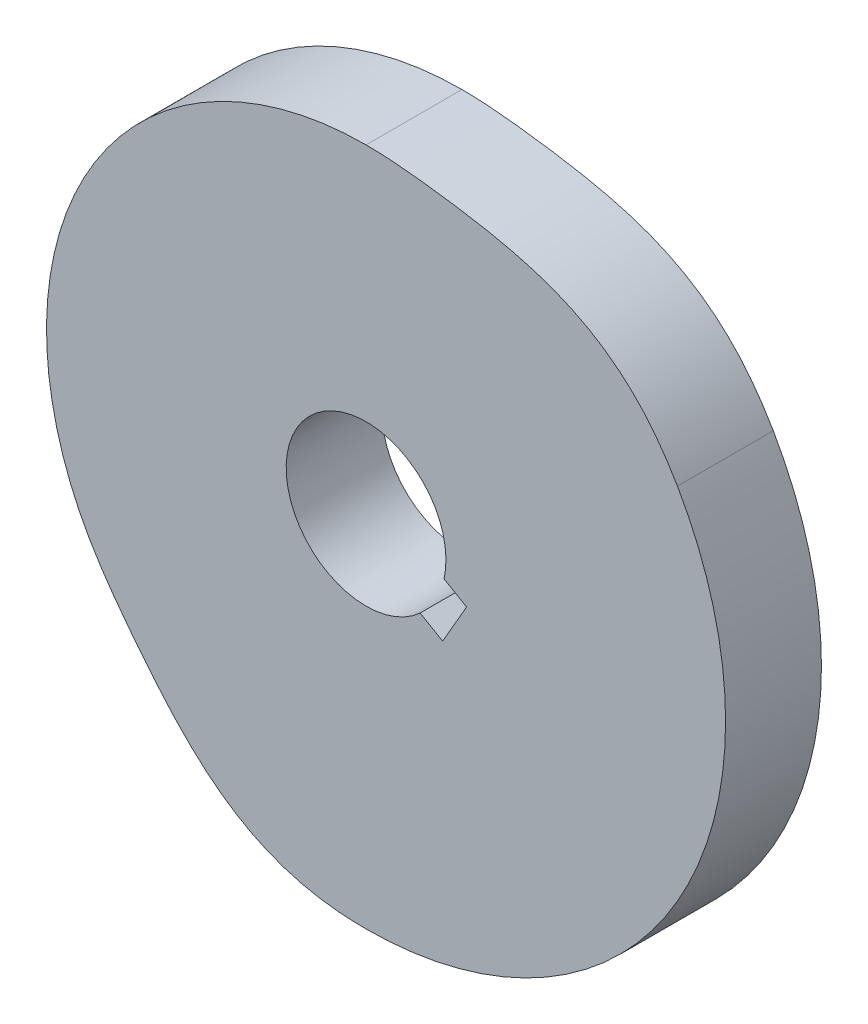
ISO-10303-21;
HEADER;
FILE_DESCRIPTION(('STEP AP214'),'2;1');
FILE_NAME('part.step','',(''),(''),'','','');
FILE_SCHEMA(('AUTOMOTIVE_DESIGN { 1 0 10303 214 1 1 1 1 }'));
ENDSEC;
DATA;
#1=APPLICATION_CONTEXT('core data for automotive mechanical design processes');
#2=APPLICATION_PROTOCOL_DEFINITION('international standard','automotive_design',2000,#1);
#3=PRODUCT_CONTEXT('',#1,'mechanical');
#4=PRODUCT('Part','Part','',(#3));
#5=PRODUCT_RELATED_PRODUCT_CATEGORY('part','',(#4));
#6=PRODUCT_DEFINITION_FORMATION('','',#4);
#7=PRODUCT_DEFINITION_CONTEXT('part definition',#1,'design');
#8=PRODUCT_DEFINITION('design','',#6,#7);
#9=PRODUCT_DEFINITION_SHAPE('','',#8);
#10=(LENGTH_UNIT() NAMED_UNIT(*) SI_UNIT(.MILLI.,.METRE.));
#11=(NAMED_UNIT(*) PLANE_ANGLE_UNIT() SI_UNIT($,.RADIAN.));
#12=(NAMED_UNIT(*) SI_UNIT($,.STERADIAN.) SOLID_ANGLE_UNIT());
#13=UNCERTAINTY_MEASURE_WITH_UNIT(LENGTH_MEASURE(1.E-05),#10,'distance_accuracy_value','');
#14=(GEOMETRIC_REPRESENTATION_CONTEXT(3) GLOBAL_UNCERTAINTY_ASSIGNED_CONTEXT((#13)) GLOBAL_UNIT_ASSIGNED_CONTEXT((#10,
#11,#12)) REPRESENTATION_CONTEXT('',''));
#15=CARTESIAN_POINT('',(0.,0.,0.));
#16=DIRECTION('',(0.,0.,1.));
#17=DIRECTION('',(1.,0.,0.));
#18=AXIS2_PLACEMENT_3D('',#15,#16,#17);
#19=CARTESIAN_POINT('',(22.119846890356,36.5237513878752,12.));
#20=DIRECTION('',(0.,0.,1.));
#21=DIRECTION('',(1.,0.,0.));
#22=AXIS2_PLACEMENT_3D('',#19,#20,#21);
#23=PLANE('',#22);
#24=CARTESIAN_POINT('',(38.9711431702997,22.5,12.));
#25=CARTESIAN_POINT('',(38.7093504689134,22.9534419073022,12.));
#26=CARTESIAN_POINT('',(38.3047692242053,23.6267678396488,12.));
#27=CARTESIAN_POINT('',(37.7390404591507,24.5080117448406,12.));
#28=CARTESIAN_POINT('',(37.3010685746849,25.1598808103304,12.));
#29=CARTESIAN_POINT('',(36.8489283465686,25.8018937636039,12.));
#30=CARTESIAN_POINT('',(36.382207824954,26.43322654574,12.));
#31=CARTESIAN_POINT('',(35.9005756392599,27.0530443597118,12.));
#32=CARTESIAN_POINT('',(35.4037872006203,27.6605116103725,12.));
#33=CARTESIAN_POINT('',(34.8916893229601,28.2548023938018,12.));
#34=CARTESIAN_POINT('',(34.3642236103499,28.8351110024589,12.));
#35=CARTESIAN_POINT('',(33.8214284616266,29.4006623875112,12.));
#36=CARTESIAN_POINT('',(33.2634397017839,29.9507223900795,12.));
#37=CARTESIAN_POINT('',(32.6904898334102,30.4846075886696,12.));
#38=CARTESIAN_POINT('',(32.1029059323825,31.0016946046913,12.));
#39=CARTESIAN_POINT('',(31.5011062301754,31.5014287169865,12.));
#40=CARTESIAN_POINT('',(30.8855954460521,31.9833316448601,12.));
#41=CARTESIAN_POINT('',(30.2569589513353,32.4470083710961,12.));
#42=CARTESIAN_POINT('',(29.6158558656481,32.8921528905651,12.));
#43=CARTESIAN_POINT('',(28.9630112007715,33.3185527862826,12.));
#44=CARTESIAN_POINT('',(28.2992071813623,33.7260925527251,12.));
#45=CARTESIAN_POINT('',(27.6252738829632,34.1147556054543,12.));
#46=CARTESIAN_POINT('',(26.9420793363941,34.484624936213,12.));
#47=CARTESIAN_POINT('',(26.2505192536856,34.8358823932325,12.));
#48=CARTESIAN_POINT('',(25.5515065342268,35.1688065871312,12.));
#49=CARTESIAN_POINT('',(24.8459607108292,35.4837694431672,12.));
#50=CARTESIAN_POINT('',(24.134797494056,35.7812314404241,12.));
#51=CARTESIAN_POINT('',(23.4189185695591,36.0617355975334,12.));
#52=CARTESIAN_POINT('',(22.6992017974223,36.3259002825346,12.));
#53=CARTESIAN_POINT('',(21.9764919547547,36.5744109412834,12.));
#54=CARTESIAN_POINT('',(21.2515921531299,36.808010854258,12.));
#55=CARTESIAN_POINT('',(20.5252560510446,37.0274910455338,12.));
#56=CARTESIAN_POINT('',(19.7981809685145,37.2336794799527,12.));
#57=CARTESIAN_POINT('',(19.0710019963762,37.4274296949713,12.));
#58=CARTESIAN_POINT('',(18.3442871770079,37.6096090222078,12.));
#59=CARTESIAN_POINT('',(17.6185338162174,37.7810865602196,12.));
#60=CARTESIAN_POINT('',(16.894165968219,37.9427210644523,12.));
#61=CARTESIAN_POINT('',(16.1715331172115,38.0953489225405,12.));
#62=CARTESIAN_POINT('',(15.4509100603719,38.2397723831727,12.));
#63=CARTESIAN_POINT('',(14.7324979784421,38.3767482045367,12.));
#64=CARTESIAN_POINT('',(14.0164266618361,38.5069768839167,12.));
#65=CARTESIAN_POINT('',(13.3027578426846,38.631092623328,12.));
#66=CARTESIAN_POINT('',(12.5914895667666,38.7496541771411,12.));
#67=CARTESIAN_POINT('',(11.8825615241336,38.8631367164892,12.));
#68=CARTESIAN_POINT('',(11.175861243619,38.9719248319138,12.));
#69=CARTESIAN_POINT('',(10.47123104448,39.0763067802686,12.));
#70=CARTESIAN_POINT('',(9.76847562821939,39.176470064522,12.));
#71=CARTESIAN_POINT('',(9.06737018518749,39.2724984160128,12.));
#72=CARTESIAN_POINT('',(8.36766888386886,39.364370228242,12.));
#73=CARTESIAN_POINT('',(7.66911360575998,39.4519584698388,12.));
#74=CARTESIAN_POINT('',(6.97144278555543,39.5350320823696,12.));
#75=CARTESIAN_POINT('',(6.27440021466674,39.6132588467296,12.));
#76=CARTESIAN_POINT('',(5.5777436673017,39.6862096801998,12.));
#77=CARTESIAN_POINT('',(4.88125320765911,39.7533643061656,12.));
#78=CARTESIAN_POINT('',(4.18473905253608,39.8141182171193,12.));
#79=CARTESIAN_POINT('',(3.48804882810067,39.8677908410397,12.));
#80=CARTESIAN_POINT('',(2.7910742253825,39.9136347775381,12.));
#81=CARTESIAN_POINT('',(2.09375648407673,39.9508460581246,12.));
#82=CARTESIAN_POINT('',(1.1635601760718,39.9878170709664,12.));
#83=CARTESIAN_POINT('',(0.465431100008381,39.9999991230516,12.));
#84=CARTESIAN_POINT('',(0.,40.,12.));
#85=B_SPLINE_CURVE_WITH_KNOTS('',3,(#24,#25,#26,#27,#28,#29,#30,#31,#32,#33,#34,#35,#36,#37,#38,
#39,#40,#41,#42,#43,#44,#45,#46,#47,#48,#49,#50,#51,#52,#53,#54,#55,#56,#57,#58,#59,#60,#61,#62,
#63,#64,#65,#66,#67,#68,#69,#70,#71,#72,#73,#74,#75,#76,#77,#78,#79,#80,#81,#82,#83,#84),
.UNSPECIFIED.,.F.,.F.,(4,1,1,1,1,1,1,1,1,1,1,1,1,1,1,1,1,1,1,1,1,1,1,1,1,1,1,1,1,1,1,1,1,1,1,1,
1,1,1,1,1,1,1,1,1,1,1,1,1,1,1,1,1,1,1,1,1,1,4),(0.,0.0349656903816201,0.0524477612049712,
0.0699285137320489,0.0874071515107975,0.104882797102223,0.122354543573216,0.139821493872081,
0.157282786439406,0.174737606137087,0.192185180345596,0.20962476085127,0.227055592887446,
0.244476873371175,0.261887700958334,0.279287020995444,0.296673568753541,0.314045814472995,
0.331401913722197,0.348739666380906,0.366056487213003,0.383349390513558,0.400614990727402,
0.417849520270271,0.43504886507025,0.452208617616787,0.469324146585199,0.486390681420865,
0.503403409640334,0.520357584053338,0.537248636644474,0.554072295487663,0.570824700810579,
0.587502516189498,0.604103030846312,0.620624249147377,0.637064963675924,0.653424808671017,
0.669704291197709,0.685904798129849,0.702028577875175,0.718078696727588,0.73405897075783,
0.749973875203704,0.765828434337396,0.781628095707418,0.797378593412965,0.813085805611701,
0.828755611743744,0.844393754948468,0.860005714852658,0.875596595336954,0.89117103108201,
0.906733115712345,0.92228635326037,0.937833633534871,0.953377230863467,0.968918824644994,1.),.UNSPECIFIED.);
#86=CARTESIAN_POINT('',(38.9711431702997,22.5,12.));
#87=VERTEX_POINT('',#86);
#88=CARTESIAN_POINT('',(0.,40.,12.));
#89=VERTEX_POINT('',#88);
#90=EDGE_CURVE('E143',#87,#89,#85,.T.);
#91=ORIENTED_EDGE('',*,*,#90,.T.);
#92=CARTESIAN_POINT('',(0.,0.,12.));
#93=DIRECTION('',(0.,0.,1.));
#94=DIRECTION('',(-1.,0.,0.));
#95=AXIS2_PLACEMENT_3D('',#92,#93,#94);
#96=CIRCLE('',#95,40.);
#97=CARTESIAN_POINT('',(-34.6410161513775,-20.,12.));
#98=VERTEX_POINT('',#97);
#99=EDGE_CURVE('E150',#89,#98,#96,.T.);
#100=ORIENTED_EDGE('',*,*,#99,.T.);
#101=CARTESIAN_POINT('',(-34.6410161513775,-20.,12.));
#102=CARTESIAN_POINT('',(-34.4082998419137,-20.4030747178444,12.));
#103=CARTESIAN_POINT('',(-34.0486853373061,-21.0015812067933,12.));
#104=CARTESIAN_POINT('',(-33.551569346979,-21.7886693336111,12.));
#105=CARTESIAN_POINT('',(-33.1706845620308,-22.3739585717983,12.));
#106=CARTESIAN_POINT('',(-32.7824952470546,-22.9546343152956,12.));
#107=CARTESIAN_POINT('',(-32.3876682790341,-23.5311494362647,12.));
#108=CARTESIAN_POINT('',(-31.9867967712075,-24.1039714332199,12.));
#109=CARTESIAN_POINT('',(-31.5803939293181,-24.673572551781,12.));
#110=CARTESIAN_POINT('',(-31.1688883806231,-25.2404194027767,12.));
#111=CARTESIAN_POINT('',(-30.7526207299871,-25.8049625945056,12.));
#112=CARTESIAN_POINT('',(-30.331841461049,-26.3676264420164,12.));
#113=CARTESIAN_POINT('',(-29.906710179699,-26.928798938008,12.));
#114=CARTESIAN_POINT('',(-29.4772962057575,-27.4888221338964,12.));
#115=CARTESIAN_POINT('',(-29.0435804923669,-28.0479830825482,12.));
#116=CARTESIAN_POINT('',(-28.6054588355467,-28.6065054835503,12.));
#117=CARTESIAN_POINT('',(-28.1627463170054,-29.1645421621008,12.));
#118=CARTESIAN_POINT('',(-27.7151829051606,-29.7221685001758,12.));
#119=CARTESIAN_POINT('',(-27.2624401218827,-30.2793769248772,12.));
#120=CARTESIAN_POINT('',(-26.8041286664094,-30.8360725438215,12.));
#121=CARTESIAN_POINT('',(-26.3398068734939,-31.3920700013899,12.));
#122=CARTESIAN_POINT('',(-25.8689898705466,-31.9470916128021,12.));
#123=CARTESIAN_POINT('',(-25.3911592885762,-32.500766815457,12.));
#124=CARTESIAN_POINT('',(-24.9057733743464,-33.0526329589168,12.));
#125=CARTESIAN_POINT('',(-24.4122773464131,-33.6021374364543,12.));
#126=CARTESIAN_POINT('',(-23.9101138356203,-34.1486411423892,12.));
#127=CARTESIAN_POINT('',(-23.3987332511284,-34.6914232207099,12.));
#128=CARTESIAN_POINT('',(-22.8776039160131,-35.2296870519711,12.));
#129=CARTESIAN_POINT('',(-22.3462218217491,-35.7625674074315,12.));
#130=CARTESIAN_POINT('',(-21.8041198583108,-36.2891386821519,12.));
#131=CARTESIAN_POINT('',(-21.2508763859959,-36.8084241026055,12.));
#132=CARTESIAN_POINT('',(-20.6861230262256,-37.3194057895236,12.));
#133=CARTESIAN_POINT('',(-20.1095515613041,-37.8210355434644,12.));
#134=CARTESIAN_POINT('',(-19.5209198472419,-38.312246209164,12.));
#135=CARTESIAN_POINT('',(-18.9200566590697,-38.7919634652576,12.));
#136=CARTESIAN_POINT('',(-18.3068654043982,-39.2591178785917,12.));
#137=CARTESIAN_POINT('',(-17.6813266581237,-39.7126570571701,12.));
#138=CARTESIAN_POINT('',(-17.0434994889436,-40.1515577328405,12.));
#139=CARTESIAN_POINT('',(-16.3935215665417,-40.5748376041996,12.));
#140=CARTESIAN_POINT('',(-15.7316080567394,-40.981566771876,12.));
#141=CARTESIAN_POINT('',(-15.058049330364,-41.3708786023813,12.));
#142=CARTESIAN_POINT('',(-14.3732075298677,-41.7419798631026,12.));
#143=CARTESIAN_POINT('',(-13.6775120555671,-42.0941599797522,12.));
#144=CARTESIAN_POINT('',(-12.9714540505079,-42.4267992786674,12.));
#145=CARTESIAN_POINT('',(-12.2555799790855,-42.7393760897201,12.));
#146=CARTESIAN_POINT('',(-11.5304844093273,-43.0314726011374,12.));
#147=CARTESIAN_POINT('',(-10.7968021218384,-43.3027793750911,12.));
#148=CARTESIAN_POINT('',(-10.0551996794826,-43.553098452225,12.));
#149=CARTESIAN_POINT('',(-9.30636660061228,-43.7823449940365,12.));
#150=CARTESIAN_POINT('',(-8.551006284861,-43.9905474338023,12.));
#151=CARTESIAN_POINT('',(-7.78982684389867,-44.1778461291215,12.));
#152=CARTESIAN_POINT('',(-7.02353199046165,-44.3444905315386,12.));
#153=CARTESIAN_POINT('',(-6.25281213594689,-44.4908349111018,12.));
#154=CARTESIAN_POINT('',(-5.4783358455878,-44.6173326939398,12.));
#155=CARTESIAN_POINT('',(-4.70074178012304,-44.7245294950452,12.));
#156=CARTESIAN_POINT('',(-3.92063129174394,-44.8130549321628,12.));
#157=CARTESIAN_POINT('',(-3.13856165059226,-44.8836133791477,12.));
#158=CARTESIAN_POINT('',(-2.35504053770398,-44.9369736244935,12.));
#159=CARTESIAN_POINT('',(-1.30899654635034,-44.9862871540866,12.));
#160=CARTESIAN_POINT('',(-0.52358856155732,-45.0000018237252,12.));
#161=CARTESIAN_POINT('',(0.,-45.,12.));
#162=B_SPLINE_CURVE_WITH_KNOTS('',3,(#101,#102,#103,#104,#105,#106,#107,#108,#109,#110,#111,
#112,#113,#114,#115,#116,#117,#118,#119,#120,#121,#122,#123,#124,#125,#126,#127,#128,#129,#130,
#131,#132,#133,#134,#135,#136,#137,#138,#139,#140,#141,#142,#143,#144,#145,#146,#147,#148,#149,
#150,#151,#152,#153,#154,#155,#156,#157,#158,#159,#160,#161),.UNSPECIFIED.,.F.,.F.,(4,1,1,1,1,1,
1,1,1,1,1,1,1,1,1,1,1,1,1,1,1,1,1,1,1,1,1,1,1,1,1,1,1,1,1,1,1,1,1,1,1,1,1,1,1,1,1,1,1,1,1,1,1,1,
1,1,1,1,4),(0.,0.0310811753550052,0.0466227691365323,0.062166366465129,0.0777136467396299,
0.0932668842876541,0.10882896891799,0.124403404663045,0.139994285147341,0.155606245051532,
0.171244388256256,0.186914194388299,0.202621406587035,0.218371904292581,0.234171565662604,
0.250026124796296,0.26594102924217,0.281921303272411,0.297971422124825,0.314095201870151,
0.33029570880229,0.346575191328983,0.362935036324076,0.379375750852623,0.395896969153688,
0.412497483810502,0.429175299189421,0.445927704512336,0.462751363355525,0.479642415946662,
0.496596590359666,0.513609318579135,0.530675853414801,0.547791382383213,0.56495113492975,
0.582150479729729,0.599385009272598,0.616650609486442,0.633943512786997,0.651260333619093,
0.668598086277803,0.685954185527005,0.703326431246459,0.720712979004556,0.738112299041666,
0.755523126628825,0.772944407112554,0.79037523914873,0.807814819654403,0.825262393862912,
0.842717213560594,0.860178506127919,0.877645456426784,0.895117202897777,0.912592848489203,
0.930071486267951,0.947552238795029,0.96503430961838,1.),.UNSPECIFIED.);
#163=CARTESIAN_POINT('',(0.,-45.,12.));
#164=VERTEX_POINT('',#163);
#165=EDGE_CURVE('E157',#98,#164,#162,.T.);
#166=ORIENTED_EDGE('',*,*,#165,.T.);
#167=CARTESIAN_POINT('',(0.,0.,12.));
#168=DIRECTION('',(0.,0.,1.));
#169=DIRECTION('',(-1.,0.,0.));
#170=AXIS2_PLACEMENT_3D('',#167,#168,#169);
#171=CIRCLE('',#170,45.);
#172=EDGE_CURVE('E163',#164,#87,#171,.T.);
#173=ORIENTED_EDGE('',*,*,#172,.T.);
#174=EDGE_LOOP('',(#91,#100,#166,#173));
#175=FACE_BOUND('',#174,.T.);
#176=DIRECTION('',(0.866025403784439,-0.5,0.));
#177=VECTOR('',#176,1.);
#178=CARTESIAN_POINT('',(9.58512512714551,-8.99807618751146,12.));
#179=LINE('',#178,#177);
#180=CARTESIAN_POINT('',(6.76135582092916,-7.36777221843804,12.));
#181=VERTEX_POINT('',#180);
#182=CARTESIAN_POINT('',(9.58512512714551,-8.99807618751146,12.));
#183=VERTEX_POINT('',#182);
#184=EDGE_CURVE('E117',#181,#183,#179,.T.);
#185=ORIENTED_EDGE('',*,*,#184,.F.);
#186=CARTESIAN_POINT('',(0.,0.,12.));
#187=DIRECTION('',(0.,0.,1.));
#188=DIRECTION('',(1.,0.,0.));
#189=AXIS2_PLACEMENT_3D('',#186,#187,#188);
#190=CIRCLE('',#189,10.);
#191=CARTESIAN_POINT('',(9.76135582092916,-2.17161979573141,12.));
#192=VERTEX_POINT('',#191);
#193=EDGE_CURVE('E108',#192,#181,#190,.T.);
#194=ORIENTED_EDGE('',*,*,#193,.F.);
#195=DIRECTION('',(-0.866025403784439,0.5,0.));
#196=VECTOR('',#195,1.);
#197=CARTESIAN_POINT('',(9.76135582092916,-2.17161979573141,12.));
#198=LINE('',#197,#196);
#199=CARTESIAN_POINT('',(12.5851251271455,-3.80192376480482,12.));
#200=VERTEX_POINT('',#199);
#201=EDGE_CURVE('E133',#200,#192,#198,.T.);
#202=ORIENTED_EDGE('',*,*,#201,.F.);
#203=DIRECTION('',(0.5,0.866025403784439,0.));
#204=VECTOR('',#203,1.);
#205=CARTESIAN_POINT('',(12.5851251271455,-3.80192376480482,12.));
#206=LINE('',#205,#204);
#207=EDGE_CURVE('E129',#183,#200,#206,.T.);
#208=ORIENTED_EDGE('',*,*,#207,.F.);
#209=EDGE_LOOP('',(#185,#194,#202,#208));
#210=FACE_BOUND('',#209,.T.);
#211=ADVANCED_FACE('F43',(#175,#210),#23,.T.);
#212=CARTESIAN_POINT('',(22.119846890356,36.5237513878752,0.));
#213=DIRECTION('',(0.,0.,1.));
#214=DIRECTION('',(1.,0.,0.));
#215=AXIS2_PLACEMENT_3D('',#212,#213,#214);
#216=PLANE('',#215);
#217=CARTESIAN_POINT('',(38.9711431702997,22.5,0.));
#218=CARTESIAN_POINT('',(38.7093504689134,22.9534419073022,0.));
#219=CARTESIAN_POINT('',(38.3047692242053,23.6267678396488,0.));
#220=CARTESIAN_POINT('',(37.7390404591507,24.5080117448406,0.));
#221=CARTESIAN_POINT('',(37.3010685746849,25.1598808103304,0.));
#222=CARTESIAN_POINT('',(36.8489283465686,25.8018937636039,0.));
#223=CARTESIAN_POINT('',(36.382207824954,26.43322654574,0.));
#224=CARTESIAN_POINT('',(35.9005756392599,27.0530443597118,0.));
#225=CARTESIAN_POINT('',(35.4037872006203,27.6605116103725,0.));
#226=CARTESIAN_POINT('',(34.8916893229601,28.2548023938018,0.));
#227=CARTESIAN_POINT('',(34.3642236103499,28.8351110024589,0.));
#228=CARTESIAN_POINT('',(33.8214284616266,29.4006623875112,0.));
#229=CARTESIAN_POINT('',(33.2634397017839,29.9507223900795,0.));
#230=CARTESIAN_POINT('',(32.6904898334102,30.4846075886696,0.));
#231=CARTESIAN_POINT('',(32.1029059323825,31.0016946046913,0.));
#232=CARTESIAN_POINT('',(31.5011062301754,31.5014287169865,0.));
#233=CARTESIAN_POINT('',(30.8855954460521,31.9833316448601,0.));
#234=CARTESIAN_POINT('',(30.2569589513353,32.4470083710961,0.));
#235=CARTESIAN_POINT('',(29.6158558656481,32.8921528905651,0.));
#236=CARTESIAN_POINT('',(28.9630112007715,33.3185527862826,0.));
#237=CARTESIAN_POINT('',(28.2992071813623,33.7260925527251,0.));
#238=CARTESIAN_POINT('',(27.6252738829632,34.1147556054543,0.));
#239=CARTESIAN_POINT('',(26.9420793363941,34.484624936213,0.));
#240=CARTESIAN_POINT('',(26.2505192536856,34.8358823932325,0.));
#241=CARTESIAN_POINT('',(25.5515065342268,35.1688065871312,0.));
#242=CARTESIAN_POINT('',(24.8459607108292,35.4837694431672,0.));
#243=CARTESIAN_POINT('',(24.134797494056,35.7812314404241,0.));
#244=CARTESIAN_POINT('',(23.4189185695591,36.0617355975334,0.));
#245=CARTESIAN_POINT('',(22.6992017974223,36.3259002825346,0.));
#246=CARTESIAN_POINT('',(21.9764919547547,36.5744109412834,0.));
#247=CARTESIAN_POINT('',(21.2515921531299,36.808010854258,0.));
#248=CARTESIAN_POINT('',(20.5252560510446,37.0274910455338,0.));
#249=CARTESIAN_POINT('',(19.7981809685145,37.2336794799527,0.));
#250=CARTESIAN_POINT('',(19.0710019963762,37.4274296949713,0.));
#251=CARTESIAN_POINT('',(18.3442871770079,37.6096090222078,0.));
#252=CARTESIAN_POINT('',(17.6185338162174,37.7810865602196,0.));
#253=CARTESIAN_POINT('',(16.894165968219,37.9427210644523,0.));
#254=CARTESIAN_POINT('',(16.1715331172115,38.0953489225405,0.));
#255=CARTESIAN_POINT('',(15.4509100603719,38.2397723831727,0.));
#256=CARTESIAN_POINT('',(14.7324979784421,38.3767482045367,0.));
#257=CARTESIAN_POINT('',(14.0164266618361,38.5069768839167,0.));
#258=CARTESIAN_POINT('',(13.3027578426846,38.631092623328,0.));
#259=CARTESIAN_POINT('',(12.5914895667666,38.7496541771411,0.));
#260=CARTESIAN_POINT('',(11.8825615241336,38.8631367164892,0.));
#261=CARTESIAN_POINT('',(11.175861243619,38.9719248319138,0.));
#262=CARTESIAN_POINT('',(10.47123104448,39.0763067802686,0.));
#263=CARTESIAN_POINT('',(9.76847562821939,39.176470064522,0.));
#264=CARTESIAN_POINT('',(9.06737018518749,39.2724984160128,0.));
#265=CARTESIAN_POINT('',(8.36766888386886,39.364370228242,0.));
#266=CARTESIAN_POINT('',(7.66911360575998,39.4519584698388,0.));
#267=CARTESIAN_POINT('',(6.97144278555543,39.5350320823696,0.));
#268=CARTESIAN_POINT('',(6.27440021466674,39.6132588467296,0.));
#269=CARTESIAN_POINT('',(5.5777436673017,39.6862096801998,0.));
#270=CARTESIAN_POINT('',(4.88125320765911,39.7533643061656,0.));
#271=CARTESIAN_POINT('',(4.18473905253608,39.8141182171193,0.));
#272=CARTESIAN_POINT('',(3.48804882810067,39.8677908410397,0.));
#273=CARTESIAN_POINT('',(2.7910742253825,39.9136347775381,0.));
#274=CARTESIAN_POINT('',(2.09375648407673,39.9508460581246,0.));
#275=CARTESIAN_POINT('',(1.1635601760718,39.9878170709664,0.));
#276=CARTESIAN_POINT('',(0.465431100008381,39.9999991230516,0.));
#277=CARTESIAN_POINT('',(0.,40.,0.));
#278=B_SPLINE_CURVE_WITH_KNOTS('',3,(#217,#218,#219,#220,#221,#222,#223,#224,#225,#226,#227,
#228,#229,#230,#231,#232,#233,#234,#235,#236,#237,#238,#239,#240,#241,#242,#243,#244,#245,#246,
#247,#248,#249,#250,#251,#252,#253,#254,#255,#256,#257,#258,#259,#260,#261,#262,#263,#264,#265,
#266,#267,#268,#269,#270,#271,#272,#273,#274,#275,#276,#277),.UNSPECIFIED.,.F.,.F.,(4,1,1,1,1,1,
1,1,1,1,1,1,1,1,1,1,1,1,1,1,1,1,1,1,1,1,1,1,1,1,1,1,1,1,1,1,1,1,1,1,1,1,1,1,1,1,1,1,1,1,1,1,1,1,
1,1,1,1,4),(0.,0.0349656903816201,0.0524477612049712,0.0699285137320489,0.0874071515107975,
0.104882797102223,0.122354543573216,0.139821493872081,0.157282786439406,0.174737606137087,
0.192185180345596,0.20962476085127,0.227055592887446,0.244476873371175,0.261887700958334,
0.279287020995444,0.296673568753541,0.314045814472995,0.331401913722197,0.348739666380906,
0.366056487213003,0.383349390513558,0.400614990727402,0.417849520270271,0.43504886507025,
0.452208617616787,0.469324146585199,0.486390681420865,0.503403409640334,0.520357584053338,
0.537248636644474,0.554072295487663,0.570824700810579,0.587502516189498,0.604103030846312,
0.620624249147377,0.637064963675924,0.653424808671017,0.669704291197709,0.685904798129849,
0.702028577875175,0.718078696727588,0.73405897075783,0.749973875203704,0.765828434337396,
0.781628095707418,0.797378593412965,0.813085805611701,0.828755611743744,0.844393754948468,
0.860005714852658,0.875596595336954,0.89117103108201,0.906733115712345,0.92228635326037,
0.937833633534871,0.953377230863467,0.968918824644994,1.),.UNSPECIFIED.);
#279=CARTESIAN_POINT('',(38.9711431702997,22.5,0.));
#280=VERTEX_POINT('',#279);
#281=CARTESIAN_POINT('',(0.,40.,0.));
#282=VERTEX_POINT('',#281);
#283=EDGE_CURVE('E125',#280,#282,#278,.T.);
#284=ORIENTED_EDGE('',*,*,#283,.F.);
#285=CARTESIAN_POINT('',(0.,0.,0.));
#286=DIRECTION('',(0.,0.,1.));
#287=DIRECTION('',(-1.,0.,0.));
#288=AXIS2_PLACEMENT_3D('',#285,#286,#287);
#289=CIRCLE('',#288,45.);
#290=CARTESIAN_POINT('',(0.,-45.,0.));
#291=VERTEX_POINT('',#290);
#292=EDGE_CURVE('E151',#291,#280,#289,.T.);
#293=ORIENTED_EDGE('',*,*,#292,.F.);
#294=CARTESIAN_POINT('',(-34.6410161513775,-20.,0.));
#295=CARTESIAN_POINT('',(-34.4082998419137,-20.4030747178444,0.));
#296=CARTESIAN_POINT('',(-34.0486853373061,-21.0015812067933,0.));
#297=CARTESIAN_POINT('',(-33.551569346979,-21.7886693336111,0.));
#298=CARTESIAN_POINT('',(-33.1706845620308,-22.3739585717983,0.));
#299=CARTESIAN_POINT('',(-32.7824952470546,-22.9546343152956,0.));
#300=CARTESIAN_POINT('',(-32.3876682790341,-23.5311494362647,0.));
#301=CARTESIAN_POINT('',(-31.9867967712075,-24.1039714332199,0.));
#302=CARTESIAN_POINT('',(-31.5803939293181,-24.673572551781,0.));
#303=CARTESIAN_POINT('',(-31.1688883806231,-25.2404194027767,0.));
#304=CARTESIAN_POINT('',(-30.7526207299871,-25.8049625945056,0.));
#305=CARTESIAN_POINT('',(-30.331841461049,-26.3676264420164,0.));
#306=CARTESIAN_POINT('',(-29.906710179699,-26.928798938008,0.));
#307=CARTESIAN_POINT('',(-29.4772962057575,-27.4888221338964,0.));
#308=CARTESIAN_POINT('',(-29.0435804923669,-28.0479830825482,0.));
#309=CARTESIAN_POINT('',(-28.6054588355467,-28.6065054835503,0.));
#310=CARTESIAN_POINT('',(-28.1627463170054,-29.1645421621008,0.));
#311=CARTESIAN_POINT('',(-27.7151829051606,-29.7221685001758,0.));
#312=CARTESIAN_POINT('',(-27.2624401218827,-30.2793769248772,0.));
#313=CARTESIAN_POINT('',(-26.8041286664094,-30.8360725438215,0.));
#314=CARTESIAN_POINT('',(-26.3398068734939,-31.3920700013899,0.));
#315=CARTESIAN_POINT('',(-25.8689898705466,-31.9470916128021,0.));
#316=CARTESIAN_POINT('',(-25.3911592885762,-32.500766815457,0.));
#317=CARTESIAN_POINT('',(-24.9057733743464,-33.0526329589168,0.));
#318=CARTESIAN_POINT('',(-24.4122773464131,-33.6021374364543,0.));
#319=CARTESIAN_POINT('',(-23.9101138356203,-34.1486411423892,0.));
#320=CARTESIAN_POINT('',(-23.3987332511284,-34.6914232207099,0.));
#321=CARTESIAN_POINT('',(-22.8776039160131,-35.2296870519711,0.));
#322=CARTESIAN_POINT('',(-22.3462218217491,-35.7625674074315,0.));
#323=CARTESIAN_POINT('',(-21.8041198583108,-36.2891386821519,0.));
#324=CARTESIAN_POINT('',(-21.2508763859959,-36.8084241026055,0.));
#325=CARTESIAN_POINT('',(-20.6861230262256,-37.3194057895236,0.));
#326=CARTESIAN_POINT('',(-20.1095515613041,-37.8210355434644,0.));
#327=CARTESIAN_POINT('',(-19.5209198472419,-38.312246209164,0.));
#328=CARTESIAN_POINT('',(-18.9200566590697,-38.7919634652576,0.));
#329=CARTESIAN_POINT('',(-18.3068654043982,-39.2591178785917,0.));
#330=CARTESIAN_POINT('',(-17.6813266581237,-39.7126570571701,0.));
#331=CARTESIAN_POINT('',(-17.0434994889436,-40.1515577328405,0.));
#332=CARTESIAN_POINT('',(-16.3935215665417,-40.5748376041996,0.));
#333=CARTESIAN_POINT('',(-15.7316080567394,-40.981566771876,0.));
#334=CARTESIAN_POINT('',(-15.058049330364,-41.3708786023813,0.));
#335=CARTESIAN_POINT('',(-14.3732075298677,-41.7419798631026,0.));
#336=CARTESIAN_POINT('',(-13.6775120555671,-42.0941599797522,0.));
#337=CARTESIAN_POINT('',(-12.9714540505079,-42.4267992786674,0.));
#338=CARTESIAN_POINT('',(-12.2555799790855,-42.7393760897201,0.));
#339=CARTESIAN_POINT('',(-11.5304844093273,-43.0314726011374,0.));
#340=CARTESIAN_POINT('',(-10.7968021218384,-43.3027793750911,0.));
#341=CARTESIAN_POINT('',(-10.0551996794826,-43.553098452225,0.));
#342=CARTESIAN_POINT('',(-9.30636660061228,-43.7823449940365,0.));
#343=CARTESIAN_POINT('',(-8.551006284861,-43.9905474338023,0.));
#344=CARTESIAN_POINT('',(-7.78982684389867,-44.1778461291215,0.));
#345=CARTESIAN_POINT('',(-7.02353199046165,-44.3444905315386,0.));
#346=CARTESIAN_POINT('',(-6.25281213594689,-44.4908349111018,0.));
#347=CARTESIAN_POINT('',(-5.4783358455878,-44.6173326939398,0.));
#348=CARTESIAN_POINT('',(-4.70074178012304,-44.7245294950452,0.));
#349=CARTESIAN_POINT('',(-3.92063129174394,-44.8130549321628,0.));
#350=CARTESIAN_POINT('',(-3.13856165059226,-44.8836133791477,0.));
#351=CARTESIAN_POINT('',(-2.35504053770398,-44.9369736244935,0.));
#352=CARTESIAN_POINT('',(-1.30899654635034,-44.9862871540866,0.));
#353=CARTESIAN_POINT('',(-0.52358856155732,-45.0000018237252,0.));
#354=CARTESIAN_POINT('',(0.,-45.,0.));
#355=B_SPLINE_CURVE_WITH_KNOTS('',3,(#294,#295,#296,#297,#298,#299,#300,#301,#302,#303,#304,
#305,#306,#307,#308,#309,#310,#311,#312,#313,#314,#315,#316,#317,#318,#319,#320,#321,#322,#323,
#324,#325,#326,#327,#328,#329,#330,#331,#332,#333,#334,#335,#336,#337,#338,#339,#340,#341,#342,
#343,#344,#345,#346,#347,#348,#349,#350,#351,#352,#353,#354),.UNSPECIFIED.,.F.,.F.,(4,1,1,1,1,1,
1,1,1,1,1,1,1,1,1,1,1,1,1,1,1,1,1,1,1,1,1,1,1,1,1,1,1,1,1,1,1,1,1,1,1,1,1,1,1,1,1,1,1,1,1,1,1,1,
1,1,1,1,4),(0.,0.0310811753550052,0.0466227691365323,0.062166366465129,0.0777136467396299,
0.0932668842876541,0.10882896891799,0.124403404663045,0.139994285147341,0.155606245051532,
0.171244388256256,0.186914194388299,0.202621406587035,0.218371904292581,0.234171565662604,
0.250026124796296,0.26594102924217,0.281921303272411,0.297971422124825,0.314095201870151,
0.33029570880229,0.346575191328983,0.362935036324076,0.379375750852623,0.395896969153688,
0.412497483810502,0.429175299189421,0.445927704512336,0.462751363355525,0.479642415946662,
0.496596590359666,0.513609318579135,0.530675853414801,0.547791382383213,0.56495113492975,
0.582150479729729,0.599385009272598,0.616650609486442,0.633943512786997,0.651260333619093,
0.668598086277803,0.685954185527005,0.703326431246459,0.720712979004556,0.738112299041666,
0.755523126628825,0.772944407112554,0.79037523914873,0.807814819654403,0.825262393862912,
0.842717213560594,0.860178506127919,0.877645456426784,0.895117202897777,0.912592848489203,
0.930071486267951,0.947552238795029,0.96503430961838,1.),.UNSPECIFIED.);
#356=CARTESIAN_POINT('',(-34.6410161513775,-20.,0.));
#357=VERTEX_POINT('',#356);
#358=EDGE_CURVE('E232',#357,#291,#355,.T.);
#359=ORIENTED_EDGE('',*,*,#358,.F.);
#360=CARTESIAN_POINT('',(0.,0.,0.));
#361=DIRECTION('',(0.,0.,1.));
#362=DIRECTION('',(-1.,0.,0.));
#363=AXIS2_PLACEMENT_3D('',#360,#361,#362);
#364=CIRCLE('',#363,40.);
#365=EDGE_CURVE('E237',#282,#357,#364,.T.);
#366=ORIENTED_EDGE('',*,*,#365,.F.);
#367=EDGE_LOOP('',(#284,#293,#359,#366));
#368=FACE_BOUND('',#367,.T.);
#369=CARTESIAN_POINT('',(0.,0.,0.));
#370=DIRECTION('',(0.,0.,1.));
#371=DIRECTION('',(1.,0.,0.));
#372=AXIS2_PLACEMENT_3D('',#369,#370,#371);
#373=CIRCLE('',#372,10.);
#374=CARTESIAN_POINT('',(6.76135582092916,-7.36777221843804,0.));
#375=VERTEX_POINT('',#374);
#376=CARTESIAN_POINT('',(9.76135582092916,-2.17161979573141,0.));
#377=VERTEX_POINT('',#376);
#378=EDGE_CURVE('E11',#375,#377,#373,.F.);
#379=ORIENTED_EDGE('',*,*,#378,.F.);
#380=DIRECTION('',(-0.866025403784439,0.5,0.));
#381=VECTOR('',#380,1.);
#382=CARTESIAN_POINT('',(-0.725363103936474,-3.04531303181981,0.));
#383=LINE('',#382,#381);
#384=CARTESIAN_POINT('',(9.58512512714551,-8.99807618751146,0.));
#385=VERTEX_POINT('',#384);
#386=EDGE_CURVE('E53',#385,#375,#383,.T.);
#387=ORIENTED_EDGE('',*,*,#386,.F.);
#388=DIRECTION('',(-0.5,-0.866025403784439,0.));
#389=VECTOR('',#388,1.);
#390=CARTESIAN_POINT('',(32.430335121438,30.5709882321835,0.));
#391=LINE('',#390,#389);
#392=CARTESIAN_POINT('',(12.5851251271455,-3.80192376480482,0.));
#393=VERTEX_POINT('',#392);
#394=EDGE_CURVE('E208',#393,#385,#391,.T.);
#395=ORIENTED_EDGE('',*,*,#394,.F.);
#396=DIRECTION('',(0.866025403784439,-0.5,0.));
#397=VECTOR('',#396,1.);
#398=CARTESIAN_POINT('',(2.27463689606353,2.15083939088682,0.));
#399=LINE('',#398,#397);
#400=EDGE_CURVE('E204',#377,#393,#399,.T.);
#401=ORIENTED_EDGE('',*,*,#400,.F.);
#402=EDGE_LOOP('',(#379,#387,#395,#401));
#403=FACE_BOUND('',#402,.T.);
#404=ADVANCED_FACE('F181',(#368,#403),#216,.F.);
#405=DIRECTION('',(0.,0.,-1.));
#406=VECTOR('',#405,1.);
#407=SURFACE_OF_LINEAR_EXTRUSION('',#85,#406);
#408=ORIENTED_EDGE('',*,*,#283,.T.);
#409=DIRECTION('',(0.,0.,-1.));
#410=VECTOR('',#409,1.);
#411=CARTESIAN_POINT('',(0.,40.,12.));
#412=LINE('',#411,#410);
#413=EDGE_CURVE('E209',#89,#282,#412,.T.);
#414=ORIENTED_EDGE('',*,*,#413,.F.);
#415=ORIENTED_EDGE('',*,*,#90,.F.);
#416=DIRECTION('',(0.,0.,-1.));
#417=VECTOR('',#416,1.);
#418=CARTESIAN_POINT('',(38.9711431702997,22.5,12.));
#419=LINE('',#418,#417);
#420=EDGE_CURVE('E226',#87,#280,#419,.T.);
#421=ORIENTED_EDGE('',*,*,#420,.T.);
#422=EDGE_LOOP('',(#408,#414,#415,#421));
#423=FACE_BOUND('',#422,.T.);
#424=ADVANCED_FACE('F45',(#423),#407,.F.);
#425=CARTESIAN_POINT('',(0.,0.,12.));
#426=DIRECTION('',(0.,0.,-1.));
#427=DIRECTION('',(-1.,0.,0.));
#428=AXIS2_PLACEMENT_3D('',#425,#426,#427);
#429=CYLINDRICAL_SURFACE('',#428,40.);
#430=ORIENTED_EDGE('',*,*,#365,.T.);
#431=DIRECTION('',(0.,0.,-1.));
#432=VECTOR('',#431,1.);
#433=CARTESIAN_POINT('',(-34.6410161513775,-20.,12.));
#434=LINE('',#433,#432);
#435=EDGE_CURVE('E218',#98,#357,#434,.T.);
#436=ORIENTED_EDGE('',*,*,#435,.F.);
#437=ORIENTED_EDGE('',*,*,#99,.F.);
#438=ORIENTED_EDGE('',*,*,#413,.T.);
#439=EDGE_LOOP('',(#430,#436,#437,#438));
#440=FACE_BOUND('',#439,.T.);
#441=ADVANCED_FACE('F173',(#440),#429,.T.);
#442=DIRECTION('',(0.,0.,-1.));
#443=VECTOR('',#442,1.);
#444=SURFACE_OF_LINEAR_EXTRUSION('',#162,#443);
#445=ORIENTED_EDGE('',*,*,#358,.T.);
#446=DIRECTION('',(0.,0.,-1.));
#447=VECTOR('',#446,1.);
#448=CARTESIAN_POINT('',(0.,-45.,12.));
#449=LINE('',#448,#447);
#450=EDGE_CURVE('E222',#164,#291,#449,.T.);
#451=ORIENTED_EDGE('',*,*,#450,.F.);
#452=ORIENTED_EDGE('',*,*,#165,.F.);
#453=ORIENTED_EDGE('',*,*,#435,.T.);
#454=EDGE_LOOP('',(#445,#451,#452,#453));
#455=FACE_BOUND('',#454,.T.);
#456=ADVANCED_FACE('F169',(#455),#444,.F.);
#457=CARTESIAN_POINT('',(0.,0.,12.));
#458=DIRECTION('',(0.,0.,-1.));
#459=DIRECTION('',(-1.,0.,0.));
#460=AXIS2_PLACEMENT_3D('',#457,#458,#459);
#461=CYLINDRICAL_SURFACE('',#460,45.);
#462=ORIENTED_EDGE('',*,*,#292,.T.);
#463=ORIENTED_EDGE('',*,*,#420,.F.);
#464=ORIENTED_EDGE('',*,*,#172,.F.);
#465=ORIENTED_EDGE('',*,*,#450,.T.);
#466=EDGE_LOOP('',(#462,#463,#464,#465));
#467=FACE_BOUND('',#466,.T.);
#468=ADVANCED_FACE('F172',(#467),#461,.T.);
#469=CARTESIAN_POINT('',(0.,0.,12.));
#470=DIRECTION('',(0.,0.,-1.));
#471=DIRECTION('',(-1.,0.,0.));
#472=AXIS2_PLACEMENT_3D('',#469,#470,#471);
#473=CYLINDRICAL_SURFACE('',#472,10.);
#474=ORIENTED_EDGE('',*,*,#378,.T.);
#475=DIRECTION('',(0.,0.,-1.));
#476=VECTOR('',#475,1.);
#477=CARTESIAN_POINT('',(9.76135582092916,-2.17161979573141,12.));
#478=LINE('',#477,#476);
#479=EDGE_CURVE('E65',#192,#377,#478,.T.);
#480=ORIENTED_EDGE('',*,*,#479,.F.);
#481=ORIENTED_EDGE('',*,*,#193,.T.);
#482=DIRECTION('',(0.,0.,-1.));
#483=VECTOR('',#482,1.);
#484=CARTESIAN_POINT('',(6.76135582092916,-7.36777221843804,12.));
#485=LINE('',#484,#483);
#486=EDGE_CURVE('E111',#181,#375,#485,.T.);
#487=ORIENTED_EDGE('',*,*,#486,.T.);
#488=EDGE_LOOP('',(#474,#480,#481,#487));
#489=FACE_BOUND('',#488,.T.);
#490=ADVANCED_FACE('F110',(#489),#473,.F.);
#491=CARTESIAN_POINT('',(9.58512512714551,-8.99807618751146,12.));
#492=DIRECTION('',(0.5,0.866025403784439,0.));
#493=DIRECTION('',(-0.866025403784439,0.5,0.));
#494=AXIS2_PLACEMENT_3D('',#491,#492,#493);
#495=PLANE('',#494);
#496=ORIENTED_EDGE('',*,*,#386,.T.);
#497=ORIENTED_EDGE('',*,*,#486,.F.);
#498=ORIENTED_EDGE('',*,*,#184,.T.);
#499=DIRECTION('',(0.,0.,-1.));
#500=VECTOR('',#499,1.);
#501=CARTESIAN_POINT('',(9.58512512714551,-8.99807618751146,12.));
#502=LINE('',#501,#500);
#503=EDGE_CURVE('E126',#183,#385,#502,.T.);
#504=ORIENTED_EDGE('',*,*,#503,.T.);
#505=EDGE_LOOP('',(#496,#497,#498,#504));
#506=FACE_BOUND('',#505,.T.);
#507=ADVANCED_FACE('F120',(#506),#495,.T.);
#508=CARTESIAN_POINT('',(12.5851251271455,-3.80192376480482,12.));
#509=DIRECTION('',(-0.866025403784439,0.5,0.));
#510=DIRECTION('',(-0.5,-0.866025403784439,0.));
#511=AXIS2_PLACEMENT_3D('',#508,#509,#510);
#512=PLANE('',#511);
#513=ORIENTED_EDGE('',*,*,#394,.T.);
#514=ORIENTED_EDGE('',*,*,#503,.F.);
#515=ORIENTED_EDGE('',*,*,#207,.T.);
#516=DIRECTION('',(0.,0.,-1.));
#517=VECTOR('',#516,1.);
#518=CARTESIAN_POINT('',(12.5851251271455,-3.80192376480482,12.));
#519=LINE('',#518,#517);
#520=EDGE_CURVE('E60',#200,#393,#519,.T.);
#521=ORIENTED_EDGE('',*,*,#520,.T.);
#522=EDGE_LOOP('',(#513,#514,#515,#521));
#523=FACE_BOUND('',#522,.T.);
#524=ADVANCED_FACE('F195',(#523),#512,.T.);
#525=CARTESIAN_POINT('',(9.76135582092916,-2.17161979573141,12.));
#526=DIRECTION('',(-0.5,-0.866025403784439,0.));
#527=DIRECTION('',(0.866025403784439,-0.5,0.));
#528=AXIS2_PLACEMENT_3D('',#525,#526,#527);
#529=PLANE('',#528);
#530=ORIENTED_EDGE('',*,*,#400,.T.);
#531=ORIENTED_EDGE('',*,*,#520,.F.);
#532=ORIENTED_EDGE('',*,*,#201,.T.);
#533=ORIENTED_EDGE('',*,*,#479,.T.);
#534=EDGE_LOOP('',(#530,#531,#532,#533));
#535=FACE_BOUND('',#534,.T.);
#536=ADVANCED_FACE('F198',(#535),#529,.T.);
#537=CLOSED_SHELL('',(#211,#404,#424,#441,#456,#468,#490,#507,#524,#536));
#538=MANIFOLD_SOLID_BREP('B2',#537);
#539=ADVANCED_BREP_SHAPE_REPRESENTATION('',(#18,#538),#14);
#540=SHAPE_DEFINITION_REPRESENTATION(#9,#539);
ENDSEC;
END-ISO-10303-21;
